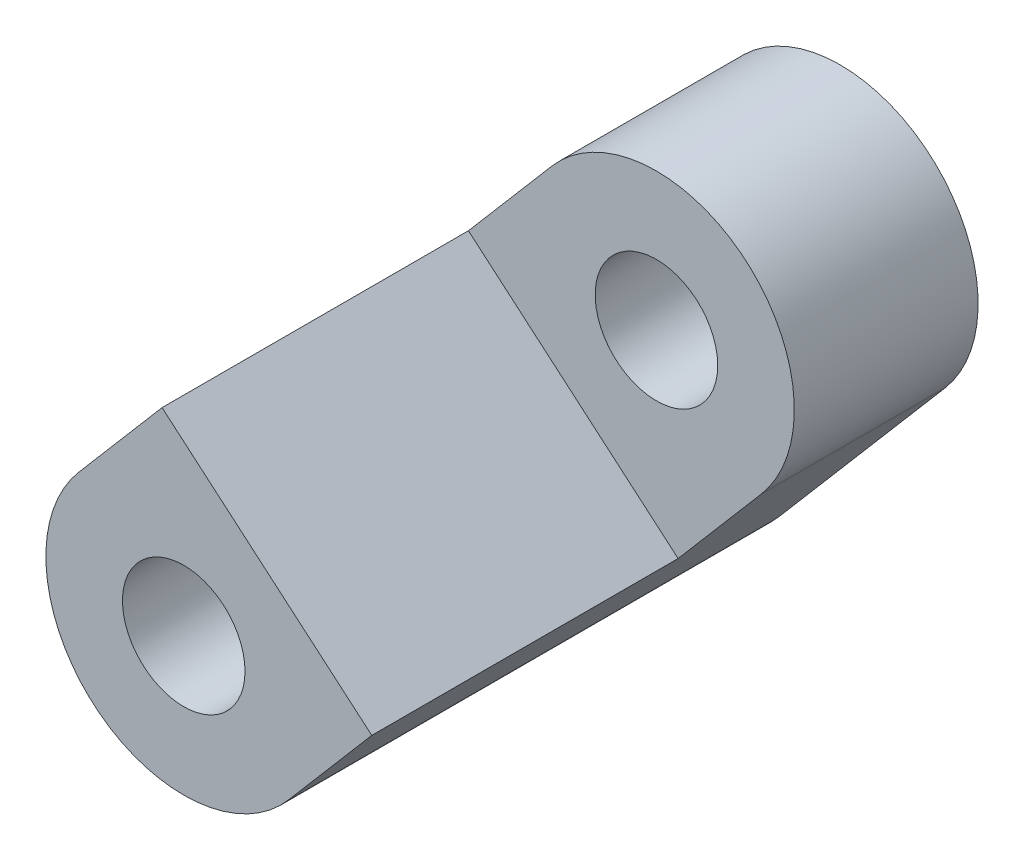
ISO-10303-21;
HEADER;
FILE_DESCRIPTION(('STEP AP214'),'2;1');
FILE_NAME('part.step','',(''),(''),'','','');
FILE_SCHEMA(('AUTOMOTIVE_DESIGN { 1 0 10303 214 1 1 1 1 }'));
ENDSEC;
DATA;
#1=APPLICATION_CONTEXT('core data for automotive mechanical design processes');
#2=APPLICATION_PROTOCOL_DEFINITION('international standard','automotive_design',2000,#1);
#3=PRODUCT_CONTEXT('',#1,'mechanical');
#4=PRODUCT('Part','Part','',(#3));
#5=PRODUCT_RELATED_PRODUCT_CATEGORY('part','',(#4));
#6=PRODUCT_DEFINITION_FORMATION('','',#4);
#7=PRODUCT_DEFINITION_CONTEXT('part definition',#1,'design');
#8=PRODUCT_DEFINITION('design','',#6,#7);
#9=PRODUCT_DEFINITION_SHAPE('','',#8);
#10=(LENGTH_UNIT() NAMED_UNIT(*) SI_UNIT(.MILLI.,.METRE.));
#11=(NAMED_UNIT(*) PLANE_ANGLE_UNIT() SI_UNIT($,.RADIAN.));
#12=(NAMED_UNIT(*) SI_UNIT($,.STERADIAN.) SOLID_ANGLE_UNIT());
#13=UNCERTAINTY_MEASURE_WITH_UNIT(LENGTH_MEASURE(1.E-05),#10,'distance_accuracy_value','');
#14=(GEOMETRIC_REPRESENTATION_CONTEXT(3) GLOBAL_UNCERTAINTY_ASSIGNED_CONTEXT((#13)) GLOBAL_UNIT_ASSIGNED_CONTEXT((#10,
#11,#12)) REPRESENTATION_CONTEXT('',''));
#15=CARTESIAN_POINT('',(0.,0.,0.));
#16=DIRECTION('',(0.,0.,1.));
#17=DIRECTION('',(1.,0.,0.));
#18=AXIS2_PLACEMENT_3D('',#15,#16,#17);
#19=CARTESIAN_POINT('',(-11.135,-10.67,8.));
#20=DIRECTION('',(0.,0.,-1.));
#21=DIRECTION('',(-1.,0.,0.));
#22=AXIS2_PLACEMENT_3D('',#19,#20,#21);
#23=CYLINDRICAL_SURFACE('',#22,2.25);
#24=CARTESIAN_POINT('',(-11.135,-10.67,3.));
#25=DIRECTION('',(0.,0.,1.));
#26=DIRECTION('',(1.,0.,0.));
#27=AXIS2_PLACEMENT_3D('',#24,#25,#26);
#28=CIRCLE('',#27,2.25);
#29=CARTESIAN_POINT('',(-9.42382708820578,-12.130954231296,3.));
#30=VERTEX_POINT('',#29);
#31=CARTESIAN_POINT('',(-12.8461729117942,-9.209045768704,3.));
#32=VERTEX_POINT('',#31);
#33=EDGE_CURVE('E87',#30,#32,#28,.T.);
#34=ORIENTED_EDGE('',*,*,#33,.F.);
#35=DIRECTION('',(0.,0.,-1.));
#36=VECTOR('',#35,1.);
#37=CARTESIAN_POINT('',(-9.42382708820578,-12.130954231296,8.));
#38=LINE('',#37,#36);
#39=CARTESIAN_POINT('',(-9.42382708820578,-12.130954231296,0.));
#40=VERTEX_POINT('',#39);
#41=EDGE_CURVE('E81',#30,#40,#38,.T.);
#42=ORIENTED_EDGE('',*,*,#41,.T.);
#43=CARTESIAN_POINT('',(-11.135,-10.67,0.));
#44=DIRECTION('',(0.,0.,1.));
#45=DIRECTION('',(1.,0.,0.));
#46=AXIS2_PLACEMENT_3D('',#43,#44,#45);
#47=CIRCLE('',#46,2.25);
#48=CARTESIAN_POINT('',(-12.8461729117942,-9.209045768704,0.));
#49=VERTEX_POINT('',#48);
#50=EDGE_CURVE('E85',#40,#49,#47,.T.);
#51=ORIENTED_EDGE('',*,*,#50,.T.);
#52=DIRECTION('',(0.,0.,-1.));
#53=VECTOR('',#52,1.);
#54=CARTESIAN_POINT('',(-12.8461729117942,-9.209045768704,8.));
#55=LINE('',#54,#53);
#56=EDGE_CURVE('E11',#32,#49,#55,.T.);
#57=ORIENTED_EDGE('',*,*,#56,.F.);
#58=EDGE_LOOP('',(#34,#42,#51,#57));
#59=FACE_BOUND('',#58,.T.);
#60=ADVANCED_FACE('F38',(#59),#23,.T.);
#61=CARTESIAN_POINT('',(-11.135,-10.67,8.));
#62=DIRECTION('',(0.,0.,-1.));
#63=DIRECTION('',(-1.,0.,0.));
#64=AXIS2_PLACEMENT_3D('',#61,#62,#63);
#65=CYLINDRICAL_SURFACE('',#64,1.);
#66=CARTESIAN_POINT('',(-11.135,-10.67,0.));
#67=DIRECTION('',(0.,0.,1.));
#68=DIRECTION('',(1.,0.,0.));
#69=AXIS2_PLACEMENT_3D('',#66,#67,#68);
#70=CIRCLE('',#69,1.);
#71=CARTESIAN_POINT('',(-10.135,-10.67,0.));
#72=VERTEX_POINT('',#71);
#73=EDGE_CURVE('E155',#72,#72,#70,.T.);
#74=ORIENTED_EDGE('',*,*,#73,.F.);
#75=EDGE_LOOP('',(#74));
#76=FACE_BOUND('',#75,.T.);
#77=CARTESIAN_POINT('',(-11.135,-10.67,3.));
#78=DIRECTION('',(0.,0.,1.));
#79=DIRECTION('',(1.,0.,0.));
#80=AXIS2_PLACEMENT_3D('',#77,#78,#79);
#81=CIRCLE('',#80,1.);
#82=CARTESIAN_POINT('',(-10.135,-10.67,3.));
#83=VERTEX_POINT('',#82);
#84=EDGE_CURVE('E41',#83,#83,#81,.T.);
#85=ORIENTED_EDGE('',*,*,#84,.T.);
#86=EDGE_LOOP('',(#85));
#87=FACE_BOUND('',#86,.T.);
#88=ADVANCED_FACE('F178',(#76,#87),#65,.F.);
#89=CARTESIAN_POINT('',(-11.135,-10.67,8.));
#90=DIRECTION('',(0.,0.,1.));
#91=DIRECTION('',(1.,0.,0.));
#92=AXIS2_PLACEMENT_3D('',#89,#90,#91);
#93=PLANE('',#92);
#94=DIRECTION('',(0.760521294130763,-0.649312991687113,0.));
#95=VECTOR('',#94,1.);
#96=CARTESIAN_POINT('',(-10.7813270882058,-13.720954231296,8.));
#97=LINE('',#96,#95);
#98=CARTESIAN_POINT('',(-14.2036729117942,-10.799045768704,8.));
#99=VERTEX_POINT('',#98);
#100=CARTESIAN_POINT('',(-10.7813270882058,-13.720954231296,8.));
#101=VERTEX_POINT('',#100);
#102=EDGE_CURVE('E142',#99,#101,#97,.T.);
#103=ORIENTED_EDGE('',*,*,#102,.F.);
#104=DIRECTION('',(-0.649312991687114,-0.760521294130763,0.));
#105=VECTOR('',#104,1.);
#106=CARTESIAN_POINT('',(-12.8461729117942,-9.209045768704,8.));
#107=LINE('',#106,#105);
#108=CARTESIAN_POINT('',(-15.5611729117942,-12.389045768704,8.));
#109=VERTEX_POINT('',#108);
#110=EDGE_CURVE('E100',#99,#109,#107,.T.);
#111=ORIENTED_EDGE('',*,*,#110,.T.);
#112=CARTESIAN_POINT('',(-13.85,-13.85,8.));
#113=DIRECTION('',(0.,0.,1.));
#114=DIRECTION('',(1.,0.,0.));
#115=AXIS2_PLACEMENT_3D('',#112,#113,#114);
#116=CIRCLE('',#115,2.25);
#117=CARTESIAN_POINT('',(-12.1388270882058,-15.310954231296,8.));
#118=VERTEX_POINT('',#117);
#119=EDGE_CURVE('E62',#109,#118,#116,.T.);
#120=ORIENTED_EDGE('',*,*,#119,.T.);
#121=DIRECTION('',(0.649312991687114,0.760521294130763,0.));
#122=VECTOR('',#121,1.);
#123=CARTESIAN_POINT('',(-9.42382708820578,-12.130954231296,8.));
#124=LINE('',#123,#122);
#125=EDGE_CURVE('E91',#118,#101,#124,.T.);
#126=ORIENTED_EDGE('',*,*,#125,.T.);
#127=EDGE_LOOP('',(#103,#111,#120,#126));
#128=FACE_BOUND('',#127,.T.);
#129=CARTESIAN_POINT('',(-13.85,-13.85,8.));
#130=DIRECTION('',(0.,0.,1.));
#131=DIRECTION('',(1.,0.,0.));
#132=AXIS2_PLACEMENT_3D('',#129,#130,#131);
#133=CIRCLE('',#132,1.);
#134=CARTESIAN_POINT('',(-12.85,-13.85,8.));
#135=VERTEX_POINT('',#134);
#136=EDGE_CURVE('E107',#135,#135,#133,.T.);
#137=ORIENTED_EDGE('',*,*,#136,.F.);
#138=EDGE_LOOP('',(#137));
#139=FACE_BOUND('',#138,.T.);
#140=ADVANCED_FACE('F147',(#128,#139),#93,.T.);
#141=CARTESIAN_POINT('',(-11.135,-10.67,0.));
#142=DIRECTION('',(0.,0.,1.));
#143=DIRECTION('',(1.,0.,0.));
#144=AXIS2_PLACEMENT_3D('',#141,#142,#143);
#145=PLANE('',#144);
#146=ORIENTED_EDGE('',*,*,#50,.F.);
#147=DIRECTION('',(0.649312991687114,0.760521294130763,0.));
#148=VECTOR('',#147,1.);
#149=CARTESIAN_POINT('',(-9.42382708820578,-12.130954231296,0.));
#150=LINE('',#149,#148);
#151=CARTESIAN_POINT('',(-12.1388270882058,-15.310954231296,0.));
#152=VERTEX_POINT('',#151);
#153=EDGE_CURVE('E95',#152,#40,#150,.T.);
#154=ORIENTED_EDGE('',*,*,#153,.F.);
#155=CARTESIAN_POINT('',(-13.85,-13.85,0.));
#156=DIRECTION('',(0.,0.,1.));
#157=DIRECTION('',(1.,0.,0.));
#158=AXIS2_PLACEMENT_3D('',#155,#156,#157);
#159=CIRCLE('',#158,2.25);
#160=CARTESIAN_POINT('',(-15.5611729117942,-12.389045768704,0.));
#161=VERTEX_POINT('',#160);
#162=EDGE_CURVE('E101',#161,#152,#159,.T.);
#163=ORIENTED_EDGE('',*,*,#162,.F.);
#164=DIRECTION('',(-0.649312991687114,-0.760521294130763,0.));
#165=VECTOR('',#164,1.);
#166=CARTESIAN_POINT('',(-12.8461729117942,-9.209045768704,0.));
#167=LINE('',#166,#165);
#168=EDGE_CURVE('E106',#49,#161,#167,.T.);
#169=ORIENTED_EDGE('',*,*,#168,.F.);
#170=EDGE_LOOP('',(#146,#154,#163,#169));
#171=FACE_BOUND('',#170,.T.);
#172=CARTESIAN_POINT('',(-13.85,-13.85,0.));
#173=DIRECTION('',(0.,0.,1.));
#174=DIRECTION('',(1.,0.,0.));
#175=AXIS2_PLACEMENT_3D('',#172,#173,#174);
#176=CIRCLE('',#175,1.);
#177=CARTESIAN_POINT('',(-12.85,-13.85,0.));
#178=VERTEX_POINT('',#177);
#179=EDGE_CURVE('E111',#178,#178,#176,.T.);
#180=ORIENTED_EDGE('',*,*,#179,.T.);
#181=EDGE_LOOP('',(#180));
#182=FACE_BOUND('',#181,.T.);
#183=ORIENTED_EDGE('',*,*,#73,.T.);
#184=EDGE_LOOP('',(#183));
#185=FACE_BOUND('',#184,.T.);
#186=ADVANCED_FACE('F104',(#171,#182,#185),#145,.F.);
#187=CARTESIAN_POINT('',(-12.8461729117942,-9.209045768704,8.));
#188=DIRECTION('',(0.760521294130763,-0.649312991687114,0.));
#189=DIRECTION('',(0.649312991687114,0.760521294130763,0.));
#190=AXIS2_PLACEMENT_3D('',#187,#188,#189);
#191=PLANE('',#190);
#192=ORIENTED_EDGE('',*,*,#110,.F.);
#193=DIRECTION('',(0.,0.,1.));
#194=VECTOR('',#193,1.);
#195=CARTESIAN_POINT('',(-14.2036729117942,-10.799045768704,3.));
#196=LINE('',#195,#194);
#197=CARTESIAN_POINT('',(-14.2036729117942,-10.799045768704,3.));
#198=VERTEX_POINT('',#197);
#199=EDGE_CURVE('E139',#198,#99,#196,.T.);
#200=ORIENTED_EDGE('',*,*,#199,.F.);
#201=DIRECTION('',(-0.649312991687114,-0.760521294130763,0.));
#202=VECTOR('',#201,1.);
#203=CARTESIAN_POINT('',(-12.8461729117942,-9.209045768704,3.));
#204=LINE('',#203,#202);
#205=EDGE_CURVE('E129',#32,#198,#204,.T.);
#206=ORIENTED_EDGE('',*,*,#205,.F.);
#207=ORIENTED_EDGE('',*,*,#56,.T.);
#208=ORIENTED_EDGE('',*,*,#168,.T.);
#209=DIRECTION('',(0.,0.,-1.));
#210=VECTOR('',#209,1.);
#211=CARTESIAN_POINT('',(-15.5611729117942,-12.389045768704,8.));
#212=LINE('',#211,#210);
#213=EDGE_CURVE('E46',#109,#161,#212,.T.);
#214=ORIENTED_EDGE('',*,*,#213,.F.);
#215=EDGE_LOOP('',(#192,#200,#206,#207,#208,#214));
#216=FACE_BOUND('',#215,.T.);
#217=ADVANCED_FACE('F124',(#216),#191,.F.);
#218=CARTESIAN_POINT('',(-13.85,-13.85,8.));
#219=DIRECTION('',(0.,0.,-1.));
#220=DIRECTION('',(-1.,0.,0.));
#221=AXIS2_PLACEMENT_3D('',#218,#219,#220);
#222=CYLINDRICAL_SURFACE('',#221,2.25);
#223=ORIENTED_EDGE('',*,*,#162,.T.);
#224=DIRECTION('',(0.,0.,-1.));
#225=VECTOR('',#224,1.);
#226=CARTESIAN_POINT('',(-12.1388270882058,-15.310954231296,8.));
#227=LINE('',#226,#225);
#228=EDGE_CURVE('E90',#118,#152,#227,.T.);
#229=ORIENTED_EDGE('',*,*,#228,.F.);
#230=ORIENTED_EDGE('',*,*,#119,.F.);
#231=ORIENTED_EDGE('',*,*,#213,.T.);
#232=EDGE_LOOP('',(#223,#229,#230,#231));
#233=FACE_BOUND('',#232,.T.);
#234=ADVANCED_FACE('F121',(#233),#222,.T.);
#235=CARTESIAN_POINT('',(-9.42382708820578,-12.130954231296,8.));
#236=DIRECTION('',(-0.760521294130763,0.649312991687114,0.));
#237=DIRECTION('',(-0.649312991687114,-0.760521294130763,0.));
#238=AXIS2_PLACEMENT_3D('',#235,#236,#237);
#239=PLANE('',#238);
#240=DIRECTION('',(0.649312991687113,0.760521294130763,0.));
#241=VECTOR('',#240,1.);
#242=CARTESIAN_POINT('',(-10.7813270882058,-13.720954231296,3.));
#243=LINE('',#242,#241);
#244=CARTESIAN_POINT('',(-10.7813270882058,-13.720954231296,3.));
#245=VERTEX_POINT('',#244);
#246=EDGE_CURVE('E145',#245,#30,#243,.T.);
#247=ORIENTED_EDGE('',*,*,#246,.F.);
#248=DIRECTION('',(0.,0.,1.));
#249=VECTOR('',#248,1.);
#250=CARTESIAN_POINT('',(-10.7813270882058,-13.720954231296,3.));
#251=LINE('',#250,#249);
#252=EDGE_CURVE('E144',#245,#101,#251,.T.);
#253=ORIENTED_EDGE('',*,*,#252,.T.);
#254=ORIENTED_EDGE('',*,*,#125,.F.);
#255=ORIENTED_EDGE('',*,*,#228,.T.);
#256=ORIENTED_EDGE('',*,*,#153,.T.);
#257=ORIENTED_EDGE('',*,*,#41,.F.);
#258=EDGE_LOOP('',(#247,#253,#254,#255,#256,#257));
#259=FACE_BOUND('',#258,.T.);
#260=ADVANCED_FACE('F96',(#259),#239,.F.);
#261=CARTESIAN_POINT('',(-13.85,-13.85,8.));
#262=DIRECTION('',(0.,0.,-1.));
#263=DIRECTION('',(-1.,0.,0.));
#264=AXIS2_PLACEMENT_3D('',#261,#262,#263);
#265=CYLINDRICAL_SURFACE('',#264,1.);
#266=ORIENTED_EDGE('',*,*,#136,.T.);
#267=EDGE_LOOP('',(#266));
#268=FACE_BOUND('',#267,.T.);
#269=ORIENTED_EDGE('',*,*,#179,.F.);
#270=EDGE_LOOP('',(#269));
#271=FACE_BOUND('',#270,.T.);
#272=ADVANCED_FACE('F163',(#268,#271),#265,.F.);
#273=CARTESIAN_POINT('',(-10.7813270882058,-13.720954231296,3.));
#274=DIRECTION('',(-0.649312991687113,-0.760521294130763,0.));
#275=DIRECTION('',(0.760521294130763,-0.649312991687113,0.));
#276=AXIS2_PLACEMENT_3D('',#273,#274,#275);
#277=PLANE('',#276);
#278=ORIENTED_EDGE('',*,*,#102,.T.);
#279=ORIENTED_EDGE('',*,*,#252,.F.);
#280=DIRECTION('',(0.760521294130763,-0.649312991687113,0.));
#281=VECTOR('',#280,1.);
#282=CARTESIAN_POINT('',(-10.7813270882058,-13.720954231296,3.));
#283=LINE('',#282,#281);
#284=EDGE_CURVE('E53',#198,#245,#283,.T.);
#285=ORIENTED_EDGE('',*,*,#284,.F.);
#286=ORIENTED_EDGE('',*,*,#199,.T.);
#287=EDGE_LOOP('',(#278,#279,#285,#286));
#288=FACE_BOUND('',#287,.T.);
#289=ADVANCED_FACE('F141',(#288),#277,.F.);
#290=CARTESIAN_POINT('',(-11.135,-10.67,3.));
#291=DIRECTION('',(0.,0.,1.));
#292=DIRECTION('',(1.,0.,0.));
#293=AXIS2_PLACEMENT_3D('',#290,#291,#292);
#294=PLANE('',#293);
#295=ORIENTED_EDGE('',*,*,#84,.F.);
#296=EDGE_LOOP('',(#295));
#297=FACE_BOUND('',#296,.T.);
#298=ORIENTED_EDGE('',*,*,#33,.T.);
#299=ORIENTED_EDGE('',*,*,#205,.T.);
#300=ORIENTED_EDGE('',*,*,#284,.T.);
#301=ORIENTED_EDGE('',*,*,#246,.T.);
#302=EDGE_LOOP('',(#298,#299,#300,#301));
#303=FACE_BOUND('',#302,.T.);
#304=ADVANCED_FACE('F172',(#297,#303),#294,.T.);
#305=CLOSED_SHELL('',(#60,#88,#140,#186,#217,#234,#260,#272,#289,#304));
#306=MANIFOLD_SOLID_BREP('B2',#305);
#307=ADVANCED_BREP_SHAPE_REPRESENTATION('',(#18,#306),#14);
#308=SHAPE_DEFINITION_REPRESENTATION(#9,#307);
ENDSEC;
END-ISO-10303-21;
